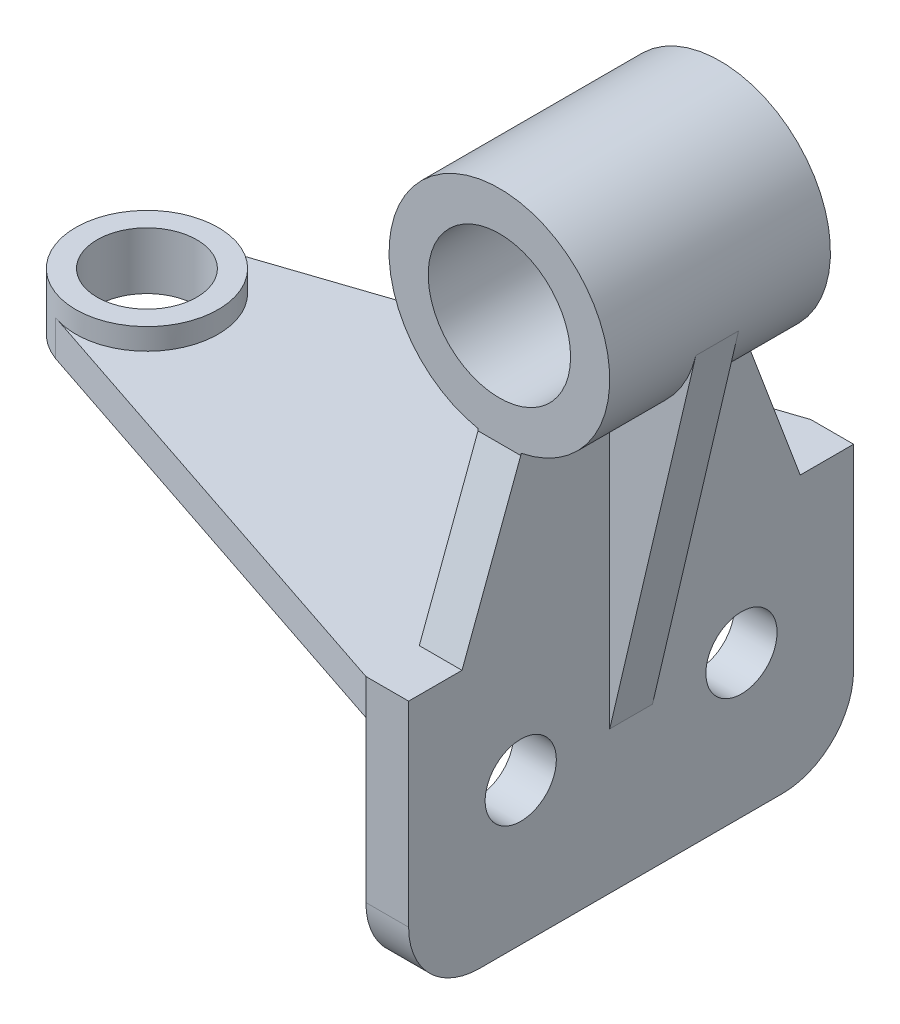
ISO-10303-21;
HEADER;
FILE_DESCRIPTION(('STEP AP214'),'2;1');
FILE_NAME('part.step','',(''),(''),'','','');
FILE_SCHEMA(('AUTOMOTIVE_DESIGN { 1 0 10303 214 1 1 1 1 }'));
ENDSEC;
DATA;
#1=APPLICATION_CONTEXT('core data for automotive mechanical design processes');
#2=APPLICATION_PROTOCOL_DEFINITION('international standard','automotive_design',2000,#1);
#3=PRODUCT_CONTEXT('',#1,'mechanical');
#4=PRODUCT('Part','Part','',(#3));
#5=PRODUCT_RELATED_PRODUCT_CATEGORY('part','',(#4));
#6=PRODUCT_DEFINITION_FORMATION('','',#4);
#7=PRODUCT_DEFINITION_CONTEXT('part definition',#1,'design');
#8=PRODUCT_DEFINITION('design','',#6,#7);
#9=PRODUCT_DEFINITION_SHAPE('','',#8);
#10=(LENGTH_UNIT() NAMED_UNIT(*) SI_UNIT(.MILLI.,.METRE.));
#11=(NAMED_UNIT(*) PLANE_ANGLE_UNIT() SI_UNIT($,.RADIAN.));
#12=(NAMED_UNIT(*) SI_UNIT($,.STERADIAN.) SOLID_ANGLE_UNIT());
#13=UNCERTAINTY_MEASURE_WITH_UNIT(LENGTH_MEASURE(1.E-05),#10,'distance_accuracy_value','');
#14=(GEOMETRIC_REPRESENTATION_CONTEXT(3) GLOBAL_UNCERTAINTY_ASSIGNED_CONTEXT((#13)) GLOBAL_UNIT_ASSIGNED_CONTEXT((#10,
#11,#12)) REPRESENTATION_CONTEXT('',''));
#15=CARTESIAN_POINT('',(0.,0.,0.));
#16=DIRECTION('',(0.,0.,1.));
#17=DIRECTION('',(1.,0.,0.));
#18=AXIS2_PLACEMENT_3D('',#15,#16,#17);
#19=CARTESIAN_POINT('',(-6.,85.,-31.));
#20=DIRECTION('',(0.,0.,1.));
#21=DIRECTION('',(1.,0.,0.));
#22=AXIS2_PLACEMENT_3D('',#19,#20,#21);
#23=CYLINDRICAL_SURFACE('',#22,31.);
#24=CARTESIAN_POINT('',(-6.,85.,31.));
#25=DIRECTION('',(0.,0.,1.));
#26=DIRECTION('',(1.,0.,0.));
#27=AXIS2_PLACEMENT_3D('',#24,#25,#26);
#28=CIRCLE('',#27,31.);
#29=CARTESIAN_POINT('',(0.,54.5861873485089,31.));
#30=VERTEX_POINT('',#29);
#31=CARTESIAN_POINT('',(-12.,54.5861873485089,31.));
#32=VERTEX_POINT('',#31);
#33=EDGE_CURVE('E328',#30,#32,#28,.T.);
#34=ORIENTED_EDGE('',*,*,#33,.F.);
#35=DIRECTION('',(0.,0.,1.));
#36=VECTOR('',#35,1.);
#37=CARTESIAN_POINT('',(0.,54.5861873485089,-31.));
#38=LINE('',#37,#36);
#39=CARTESIAN_POINT('',(0.,54.5861873485089,6.));
#40=VERTEX_POINT('',#39);
#41=EDGE_CURVE('E298',#30,#40,#38,.F.);
#42=ORIENTED_EDGE('',*,*,#41,.T.);
#43=CARTESIAN_POINT('',(-6.,85.,6.));
#44=DIRECTION('',(0.,0.,1.));
#45=DIRECTION('',(1.,0.,0.));
#46=AXIS2_PLACEMENT_3D('',#43,#44,#45);
#47=CIRCLE('',#46,31.);
#48=CARTESIAN_POINT('',(24.1782700582824,77.9097238213609,6.));
#49=VERTEX_POINT('',#48);
#50=EDGE_CURVE('E303',#40,#49,#47,.T.);
#51=ORIENTED_EDGE('',*,*,#50,.T.);
#52=DIRECTION('',(0.,0.,1.));
#53=VECTOR('',#52,1.);
#54=CARTESIAN_POINT('',(24.1782700582824,77.9097238213609,-6.));
#55=LINE('',#54,#53);
#56=CARTESIAN_POINT('',(24.1782700582824,77.9097238213609,-6.));
#57=VERTEX_POINT('',#56);
#58=EDGE_CURVE('E320',#57,#49,#55,.T.);
#59=ORIENTED_EDGE('',*,*,#58,.F.);
#60=CARTESIAN_POINT('',(-6.,85.,-6.));
#61=DIRECTION('',(0.,0.,1.));
#62=DIRECTION('',(1.,0.,0.));
#63=AXIS2_PLACEMENT_3D('',#60,#61,#62);
#64=CIRCLE('',#63,31.);
#65=CARTESIAN_POINT('',(0.,54.5861873485089,-6.));
#66=VERTEX_POINT('',#65);
#67=EDGE_CURVE('E311',#66,#57,#64,.T.);
#68=ORIENTED_EDGE('',*,*,#67,.F.);
#69=CARTESIAN_POINT('',(0.,54.5861873485089,-31.));
#70=VERTEX_POINT('',#69);
#71=EDGE_CURVE('E51',#66,#70,#38,.F.);
#72=ORIENTED_EDGE('',*,*,#71,.T.);
#73=CARTESIAN_POINT('',(-6.,85.,-31.));
#74=DIRECTION('',(0.,0.,1.));
#75=DIRECTION('',(1.,0.,0.));
#76=AXIS2_PLACEMENT_3D('',#73,#74,#75);
#77=CIRCLE('',#76,31.);
#78=CARTESIAN_POINT('',(-12.,54.5861873485089,-31.));
#79=VERTEX_POINT('',#78);
#80=EDGE_CURVE('E11',#70,#79,#77,.T.);
#81=ORIENTED_EDGE('',*,*,#80,.T.);
#82=DIRECTION('',(0.,0.,1.));
#83=VECTOR('',#82,1.);
#84=CARTESIAN_POINT('',(-12.,54.5861873485089,-31.));
#85=LINE('',#84,#83);
#86=EDGE_CURVE('E301',#32,#79,#85,.F.);
#87=ORIENTED_EDGE('',*,*,#86,.F.);
#88=EDGE_LOOP('',(#34,#42,#51,#59,#68,#72,#81,#87));
#89=FACE_BOUND('',#88,.T.);
#90=ADVANCED_FACE('F38',(#89),#23,.T.);
#91=CARTESIAN_POINT('',(-6.,85.,-31.));
#92=DIRECTION('',(0.,0.,1.));
#93=DIRECTION('',(1.,0.,0.));
#94=AXIS2_PLACEMENT_3D('',#91,#92,#93);
#95=PLANE('',#94);
#96=ORIENTED_EDGE('',*,*,#80,.F.);
#97=DIRECTION('',(0.,1.,0.));
#98=VECTOR('',#97,1.);
#99=CARTESIAN_POINT('',(0.,60.6182937655706,-31.));
#100=LINE('',#99,#98);
#101=CARTESIAN_POINT('',(0.,54.,-31.));
#102=VERTEX_POINT('',#101);
#103=EDGE_CURVE('E232',#102,#70,#100,.T.);
#104=ORIENTED_EDGE('',*,*,#103,.F.);
#105=DIRECTION('',(1.,0.,0.));
#106=VECTOR('',#105,1.);
#107=CARTESIAN_POINT('',(-12.,54.,-31.));
#108=LINE('',#107,#106);
#109=CARTESIAN_POINT('',(-12.,54.,-31.));
#110=VERTEX_POINT('',#109);
#111=EDGE_CURVE('E246',#110,#102,#108,.T.);
#112=ORIENTED_EDGE('',*,*,#111,.F.);
#113=DIRECTION('',(0.,1.,0.));
#114=VECTOR('',#113,1.);
#115=CARTESIAN_POINT('',(-12.,60.6182937655706,-31.));
#116=LINE('',#115,#114);
#117=EDGE_CURVE('E220',#110,#79,#116,.T.);
#118=ORIENTED_EDGE('',*,*,#117,.T.);
#119=EDGE_LOOP('',(#96,#104,#112,#118));
#120=FACE_BOUND('',#119,.T.);
#121=CARTESIAN_POINT('',(-6.,85.,-31.));
#122=DIRECTION('',(0.,0.,1.));
#123=DIRECTION('',(1.,0.,0.));
#124=AXIS2_PLACEMENT_3D('',#121,#122,#123);
#125=CIRCLE('',#124,20.);
#126=CARTESIAN_POINT('',(14.,85.,-31.));
#127=VERTEX_POINT('',#126);
#128=EDGE_CURVE('E45',#127,#127,#125,.T.);
#129=ORIENTED_EDGE('',*,*,#128,.T.);
#130=EDGE_LOOP('',(#129));
#131=FACE_BOUND('',#130,.T.);
#132=ADVANCED_FACE('F333',(#120,#131),#95,.F.);
#133=CARTESIAN_POINT('',(-6.,85.,-31.));
#134=DIRECTION('',(0.,0.,1.));
#135=DIRECTION('',(1.,0.,0.));
#136=AXIS2_PLACEMENT_3D('',#133,#134,#135);
#137=CYLINDRICAL_SURFACE('',#136,20.);
#138=ORIENTED_EDGE('',*,*,#128,.F.);
#139=EDGE_LOOP('',(#138));
#140=FACE_BOUND('',#139,.T.);
#141=CARTESIAN_POINT('',(-6.,85.,31.));
#142=DIRECTION('',(0.,0.,1.));
#143=DIRECTION('',(1.,0.,0.));
#144=AXIS2_PLACEMENT_3D('',#141,#142,#143);
#145=CIRCLE('',#144,20.);
#146=CARTESIAN_POINT('',(14.,85.,31.));
#147=VERTEX_POINT('',#146);
#148=EDGE_CURVE('E323',#147,#147,#145,.T.);
#149=ORIENTED_EDGE('',*,*,#148,.T.);
#150=EDGE_LOOP('',(#149));
#151=FACE_BOUND('',#150,.T.);
#152=ADVANCED_FACE('F335',(#140,#151),#137,.F.);
#153=CARTESIAN_POINT('',(-6.,85.,31.));
#154=DIRECTION('',(0.,0.,1.));
#155=DIRECTION('',(1.,0.,0.));
#156=AXIS2_PLACEMENT_3D('',#153,#154,#155);
#157=PLANE('',#156);
#158=DIRECTION('',(0.,-1.,0.));
#159=VECTOR('',#158,1.);
#160=CARTESIAN_POINT('',(-12.,54.,31.));
#161=LINE('',#160,#159);
#162=CARTESIAN_POINT('',(-12.,54.,31.));
#163=VERTEX_POINT('',#162);
#164=EDGE_CURVE('E223',#32,#163,#161,.T.);
#165=ORIENTED_EDGE('',*,*,#164,.T.);
#166=DIRECTION('',(1.,0.,0.));
#167=VECTOR('',#166,1.);
#168=CARTESIAN_POINT('',(-12.,54.,31.));
#169=LINE('',#168,#167);
#170=CARTESIAN_POINT('',(0.,54.,31.));
#171=VERTEX_POINT('',#170);
#172=EDGE_CURVE('E244',#163,#171,#169,.T.);
#173=ORIENTED_EDGE('',*,*,#172,.T.);
#174=DIRECTION('',(0.,-1.,0.));
#175=VECTOR('',#174,1.);
#176=CARTESIAN_POINT('',(0.,54.,31.));
#177=LINE('',#176,#175);
#178=EDGE_CURVE('E235',#30,#171,#177,.T.);
#179=ORIENTED_EDGE('',*,*,#178,.F.);
#180=ORIENTED_EDGE('',*,*,#33,.T.);
#181=EDGE_LOOP('',(#165,#173,#179,#180));
#182=FACE_BOUND('',#181,.T.);
#183=ORIENTED_EDGE('',*,*,#148,.F.);
#184=EDGE_LOOP('',(#183));
#185=FACE_BOUND('',#184,.T.);
#186=ADVANCED_FACE('F338',(#182,#185),#157,.T.);
#187=CARTESIAN_POINT('',(5.56639618383919,-1.30780479420858,-6.));
#188=DIRECTION('',(-0.973492582525238,0.228718586407714,0.));
#189=DIRECTION('',(-0.228718586407714,-0.973492582525238,0.));
#190=AXIS2_PLACEMENT_3D('',#187,#188,#189);
#191=PLANE('',#190);
#192=ORIENTED_EDGE('',*,*,#58,.T.);
#193=DIRECTION('',(-0.228718586407714,-0.973492582525238,0.));
#194=VECTOR('',#193,1.);
#195=CARTESIAN_POINT('',(5.56639618383919,-1.30780479420858,6.));
#196=LINE('',#195,#194);
#197=CARTESIAN_POINT('',(0.,-25.,6.));
#198=VERTEX_POINT('',#197);
#199=EDGE_CURVE('E308',#49,#198,#196,.T.);
#200=ORIENTED_EDGE('',*,*,#199,.T.);
#201=DIRECTION('',(0.,0.,1.));
#202=VECTOR('',#201,1.);
#203=CARTESIAN_POINT('',(0.,-25.,-6.));
#204=LINE('',#203,#202);
#205=CARTESIAN_POINT('',(0.,-25.,-6.));
#206=VERTEX_POINT('',#205);
#207=EDGE_CURVE('E319',#206,#198,#204,.T.);
#208=ORIENTED_EDGE('',*,*,#207,.F.);
#209=DIRECTION('',(-0.228718586407714,-0.973492582525238,0.));
#210=VECTOR('',#209,1.);
#211=CARTESIAN_POINT('',(5.56639618383919,-1.30780479420858,-6.));
#212=LINE('',#211,#210);
#213=EDGE_CURVE('E317',#57,#206,#212,.T.);
#214=ORIENTED_EDGE('',*,*,#213,.F.);
#215=EDGE_LOOP('',(#192,#200,#208,#214));
#216=FACE_BOUND('',#215,.T.);
#217=ADVANCED_FACE('F343',(#216),#191,.F.);
#218=CARTESIAN_POINT('',(0.,0.,-6.));
#219=DIRECTION('',(0.,0.,1.));
#220=DIRECTION('',(1.,0.,0.));
#221=AXIS2_PLACEMENT_3D('',#218,#219,#220);
#222=PLANE('',#221);
#223=ORIENTED_EDGE('',*,*,#67,.T.);
#224=ORIENTED_EDGE('',*,*,#213,.T.);
#225=DIRECTION('',(0.,1.,0.));
#226=VECTOR('',#225,1.);
#227=CARTESIAN_POINT('',(0.,0.,-6.));
#228=LINE('',#227,#226);
#229=EDGE_CURVE('E314',#206,#66,#228,.T.);
#230=ORIENTED_EDGE('',*,*,#229,.T.);
#231=EDGE_LOOP('',(#223,#224,#230));
#232=FACE_BOUND('',#231,.T.);
#233=ADVANCED_FACE('F351',(#232),#222,.F.);
#234=CARTESIAN_POINT('',(0.,0.,6.));
#235=DIRECTION('',(0.,0.,1.));
#236=DIRECTION('',(1.,0.,0.));
#237=AXIS2_PLACEMENT_3D('',#234,#235,#236);
#238=PLANE('',#237);
#239=ORIENTED_EDGE('',*,*,#50,.F.);
#240=DIRECTION('',(0.,1.,0.));
#241=VECTOR('',#240,1.);
#242=CARTESIAN_POINT('',(0.,0.,6.));
#243=LINE('',#242,#241);
#244=EDGE_CURVE('E305',#198,#40,#243,.T.);
#245=ORIENTED_EDGE('',*,*,#244,.F.);
#246=ORIENTED_EDGE('',*,*,#199,.F.);
#247=EDGE_LOOP('',(#239,#245,#246));
#248=FACE_BOUND('',#247,.T.);
#249=ADVANCED_FACE('F413',(#248),#238,.T.);
#250=CARTESIAN_POINT('',(0.,10.,0.));
#251=DIRECTION('',(-1.,0.,0.));
#252=DIRECTION('',(0.,0.,1.));
#253=AXIS2_PLACEMENT_3D('',#250,#251,#252);
#254=PLANE('',#253);
#255=ORIENTED_EDGE('',*,*,#41,.F.);
#256=ORIENTED_EDGE('',*,*,#178,.T.);
#257=DIRECTION('',(0.,-0.936329177569045,0.351123441588392));
#258=VECTOR('',#257,1.);
#259=CARTESIAN_POINT('',(0.,10.,47.5));
#260=LINE('',#259,#258);
#261=CARTESIAN_POINT('',(0.,10.,47.5));
#262=VERTEX_POINT('',#261);
#263=EDGE_CURVE('E217',#171,#262,#260,.T.);
#264=ORIENTED_EDGE('',*,*,#263,.T.);
#265=DIRECTION('',(0.,0.,-1.));
#266=VECTOR('',#265,1.);
#267=CARTESIAN_POINT('',(0.,10.,0.));
#268=LINE('',#267,#266);
#269=CARTESIAN_POINT('',(0.,10.,62.5));
#270=VERTEX_POINT('',#269);
#271=EDGE_CURVE('E263',#270,#262,#268,.T.);
#272=ORIENTED_EDGE('',*,*,#271,.F.);
#273=DIRECTION('',(0.,-1.,0.));
#274=VECTOR('',#273,1.);
#275=CARTESIAN_POINT('',(0.,10.,62.5));
#276=LINE('',#275,#274);
#277=CARTESIAN_POINT('',(0.,-45.,62.5));
#278=VERTEX_POINT('',#277);
#279=EDGE_CURVE('E278',#270,#278,#276,.T.);
#280=ORIENTED_EDGE('',*,*,#279,.T.);
#281=CARTESIAN_POINT('',(0.,-45.,42.5));
#282=DIRECTION('',(1.,0.,0.));
#283=DIRECTION('',(0.,0.,-1.));
#284=AXIS2_PLACEMENT_3D('',#281,#282,#283);
#285=CIRCLE('',#284,20.);
#286=CARTESIAN_POINT('',(0.,-65.,42.5));
#287=VERTEX_POINT('',#286);
#288=EDGE_CURVE('E167',#278,#287,#285,.T.);
#289=ORIENTED_EDGE('',*,*,#288,.T.);
#290=DIRECTION('',(0.,0.,-1.));
#291=VECTOR('',#290,1.);
#292=CARTESIAN_POINT('',(0.,-65.,42.5));
#293=LINE('',#292,#291);
#294=CARTESIAN_POINT('',(0.,-65.,-42.5));
#295=VERTEX_POINT('',#294);
#296=EDGE_CURVE('E201',#287,#295,#293,.T.);
#297=ORIENTED_EDGE('',*,*,#296,.T.);
#298=CARTESIAN_POINT('',(0.,-45.,-42.5));
#299=DIRECTION('',(1.,0.,0.));
#300=DIRECTION('',(0.,0.,1.));
#301=AXIS2_PLACEMENT_3D('',#298,#299,#300);
#302=CIRCLE('',#301,20.);
#303=CARTESIAN_POINT('',(0.,-45.,-62.5));
#304=VERTEX_POINT('',#303);
#305=EDGE_CURVE('E190',#295,#304,#302,.T.);
#306=ORIENTED_EDGE('',*,*,#305,.T.);
#307=DIRECTION('',(0.,-1.,0.));
#308=VECTOR('',#307,1.);
#309=CARTESIAN_POINT('',(0.,10.,-62.5));
#310=LINE('',#309,#308);
#311=CARTESIAN_POINT('',(0.,10.,-62.5));
#312=VERTEX_POINT('',#311);
#313=EDGE_CURVE('E296',#312,#304,#310,.T.);
#314=ORIENTED_EDGE('',*,*,#313,.F.);
#315=CARTESIAN_POINT('',(0.,10.,-47.5));
#316=VERTEX_POINT('',#315);
#317=EDGE_CURVE('E266',#316,#312,#268,.T.);
#318=ORIENTED_EDGE('',*,*,#317,.F.);
#319=DIRECTION('',(0.,0.936329177569044,0.351123441588392));
#320=VECTOR('',#319,1.);
#321=CARTESIAN_POINT('',(0.,54.,-31.));
#322=LINE('',#321,#320);
#323=EDGE_CURVE('E210',#316,#102,#322,.T.);
#324=ORIENTED_EDGE('',*,*,#323,.T.);
#325=ORIENTED_EDGE('',*,*,#103,.T.);
#326=ORIENTED_EDGE('',*,*,#71,.F.);
#327=ORIENTED_EDGE('',*,*,#229,.F.);
#328=ORIENTED_EDGE('',*,*,#207,.T.);
#329=ORIENTED_EDGE('',*,*,#244,.T.);
#330=EDGE_LOOP('',(#255,#256,#264,#272,#280,#289,#297,#306,#314,#318,#324,#325,#326,#327,#328,#329));
#331=FACE_BOUND('',#330,.T.);
#332=CARTESIAN_POINT('',(0.,-25.,-31.));
#333=DIRECTION('',(1.,0.,0.));
#334=DIRECTION('',(0.,0.,-1.));
#335=AXIS2_PLACEMENT_3D('',#332,#333,#334);
#336=CIRCLE('',#335,10.);
#337=CARTESIAN_POINT('',(0.,-25.,-41.));
#338=VERTEX_POINT('',#337);
#339=EDGE_CURVE('E718',#338,#338,#336,.T.);
#340=ORIENTED_EDGE('',*,*,#339,.F.);
#341=EDGE_LOOP('',(#340));
#342=FACE_BOUND('',#341,.T.);
#343=CARTESIAN_POINT('',(0.,-25.,31.));
#344=DIRECTION('',(1.,0.,0.));
#345=DIRECTION('',(0.,0.,-1.));
#346=AXIS2_PLACEMENT_3D('',#343,#344,#345);
#347=CIRCLE('',#346,10.);
#348=CARTESIAN_POINT('',(0.,-25.,21.));
#349=VERTEX_POINT('',#348);
#350=EDGE_CURVE('E720',#349,#349,#347,.T.);
#351=ORIENTED_EDGE('',*,*,#350,.F.);
#352=EDGE_LOOP('',(#351));
#353=FACE_BOUND('',#352,.T.);
#354=ADVANCED_FACE('F363',(#331,#342,#353),#254,.F.);
#355=CARTESIAN_POINT('',(0.,10.,-62.5));
#356=DIRECTION('',(0.,0.,1.));
#357=DIRECTION('',(1.,0.,0.));
#358=AXIS2_PLACEMENT_3D('',#355,#356,#357);
#359=PLANE('',#358);
#360=ORIENTED_EDGE('',*,*,#313,.T.);
#361=DIRECTION('',(1.,0.,0.));
#362=VECTOR('',#361,1.);
#363=CARTESIAN_POINT('',(-12.,-45.,-62.5));
#364=LINE('',#363,#362);
#365=CARTESIAN_POINT('',(-12.,-45.,-62.5));
#366=VERTEX_POINT('',#365);
#367=EDGE_CURVE('E207',#366,#304,#364,.T.);
#368=ORIENTED_EDGE('',*,*,#367,.F.);
#369=DIRECTION('',(0.,1.,0.));
#370=VECTOR('',#369,1.);
#371=CARTESIAN_POINT('',(-12.,-45.,-62.5));
#372=LINE('',#371,#370);
#373=CARTESIAN_POINT('',(-12.,0.,-62.5));
#374=VERTEX_POINT('',#373);
#375=EDGE_CURVE('E172',#366,#374,#372,.T.);
#376=ORIENTED_EDGE('',*,*,#375,.T.);
#377=DIRECTION('',(0.,-1.,0.));
#378=VECTOR('',#377,1.);
#379=CARTESIAN_POINT('',(-12.,10.,-62.5));
#380=LINE('',#379,#378);
#381=CARTESIAN_POINT('',(-12.,10.,-62.5));
#382=VERTEX_POINT('',#381);
#383=EDGE_CURVE('E293',#382,#374,#380,.T.);
#384=ORIENTED_EDGE('',*,*,#383,.F.);
#385=DIRECTION('',(-1.,0.,0.));
#386=VECTOR('',#385,1.);
#387=CARTESIAN_POINT('',(0.,10.,-62.5));
#388=LINE('',#387,#386);
#389=EDGE_CURVE('E265',#312,#382,#388,.T.);
#390=ORIENTED_EDGE('',*,*,#389,.F.);
#391=EDGE_LOOP('',(#360,#368,#376,#384,#390));
#392=FACE_BOUND('',#391,.T.);
#393=ADVANCED_FACE('F384',(#392),#359,.F.);
#394=CARTESIAN_POINT('',(-12.,10.,-62.5));
#395=DIRECTION('',(0.316783244819281,0.,0.948497957721453));
#396=DIRECTION('',(0.948497957721453,0.,-0.316783244819281));
#397=AXIS2_PLACEMENT_3D('',#394,#395,#396);
#398=PLANE('',#397);
#399=DIRECTION('',(-0.948497957721453,0.,0.316783244819281));
#400=VECTOR('',#399,1.);
#401=CARTESIAN_POINT('',(-12.,0.,-62.5));
#402=LINE('',#401,#400);
#403=CARTESIAN_POINT('',(-142.335664896386,0.,-18.9699591544291));
#404=VERTEX_POINT('',#403);
#405=EDGE_CURVE('E259',#374,#404,#402,.T.);
#406=ORIENTED_EDGE('',*,*,#405,.T.);
#407=DIRECTION('',(0.,-1.,0.));
#408=VECTOR('',#407,1.);
#409=CARTESIAN_POINT('',(-142.335664896386,10.,-18.9699591544291));
#410=LINE('',#409,#408);
#411=CARTESIAN_POINT('',(-142.335664896386,10.,-18.9699591544291));
#412=VERTEX_POINT('',#411);
#413=EDGE_CURVE('E290',#412,#404,#410,.T.);
#414=ORIENTED_EDGE('',*,*,#413,.F.);
#415=DIRECTION('',(-0.948497957721453,0.,0.316783244819281));
#416=VECTOR('',#415,1.);
#417=CARTESIAN_POINT('',(-12.,10.,-62.5));
#418=LINE('',#417,#416);
#419=EDGE_CURVE('E268',#382,#412,#418,.T.);
#420=ORIENTED_EDGE('',*,*,#419,.F.);
#421=ORIENTED_EDGE('',*,*,#383,.T.);
#422=EDGE_LOOP('',(#406,#414,#420,#421));
#423=FACE_BOUND('',#422,.T.);
#424=ADVANCED_FACE('F388',(#423),#398,.F.);
#425=CARTESIAN_POINT('',(-136.,10.,0.));
#426=DIRECTION('',(0.,-1.,0.));
#427=DIRECTION('',(0.,0.,-1.));
#428=AXIS2_PLACEMENT_3D('',#425,#426,#427);
#429=CYLINDRICAL_SURFACE('',#428,20.);
#430=CARTESIAN_POINT('',(-136.,0.,0.));
#431=DIRECTION('',(0.,1.,0.));
#432=DIRECTION('',(0.,0.,1.));
#433=AXIS2_PLACEMENT_3D('',#430,#431,#432);
#434=CIRCLE('',#433,20.);
#435=CARTESIAN_POINT('',(-142.957379404208,0.,18.7508632288196));
#436=VERTEX_POINT('',#435);
#437=EDGE_CURVE('E280',#404,#436,#434,.T.);
#438=ORIENTED_EDGE('',*,*,#437,.T.);
#439=DIRECTION('',(0.,-1.,0.));
#440=VECTOR('',#439,1.);
#441=CARTESIAN_POINT('',(-142.957379404208,10.,18.7508632288196));
#442=LINE('',#441,#440);
#443=CARTESIAN_POINT('',(-142.957379404208,10.,18.7508632288196));
#444=VERTEX_POINT('',#443);
#445=EDGE_CURVE('E287',#444,#436,#442,.T.);
#446=ORIENTED_EDGE('',*,*,#445,.F.);
#447=CARTESIAN_POINT('',(-136.,10.,0.));
#448=DIRECTION('',(0.,1.,0.));
#449=DIRECTION('',(0.,0.,1.));
#450=AXIS2_PLACEMENT_3D('',#447,#448,#449);
#451=CIRCLE('',#450,20.);
#452=CARTESIAN_POINT('',(-141.710083989792,10.,19.1675491607436));
#453=VERTEX_POINT('',#452);
#454=EDGE_CURVE('E255',#444,#453,#451,.T.);
#455=ORIENTED_EDGE('',*,*,#454,.T.);
#456=EDGE_CURVE('E262',#453,#412,#451,.T.);
#457=ORIENTED_EDGE('',*,*,#456,.T.);
#458=ORIENTED_EDGE('',*,*,#413,.T.);
#459=EDGE_LOOP('',(#438,#446,#455,#457,#458));
#460=FACE_BOUND('',#459,.T.);
#461=CARTESIAN_POINT('',(-136.,16.,0.));
#462=DIRECTION('',(0.,1.,0.));
#463=DIRECTION('',(0.,0.,1.));
#464=AXIS2_PLACEMENT_3D('',#461,#462,#463);
#465=CIRCLE('',#464,20.);
#466=CARTESIAN_POINT('',(-136.,16.,20.));
#467=VERTEX_POINT('',#466);
#468=EDGE_CURVE('E256',#467,#467,#465,.T.);
#469=ORIENTED_EDGE('',*,*,#468,.F.);
#470=EDGE_LOOP('',(#469));
#471=FACE_BOUND('',#470,.T.);
#472=ADVANCED_FACE('F390',(#460,#471),#429,.T.);
#473=CARTESIAN_POINT('',(-12.,10.,62.5));
#474=DIRECTION('',(0.316857870349824,0.,-0.948473030716938));
#475=DIRECTION('',(-0.948473030716938,0.,-0.316857870349824));
#476=AXIS2_PLACEMENT_3D('',#473,#474,#475);
#477=PLANE('',#476);
#478=DIRECTION('',(0.948473030716938,0.,0.316857870349824));
#479=VECTOR('',#478,1.);
#480=CARTESIAN_POINT('',(-12.,0.,62.5));
#481=LINE('',#480,#479);
#482=CARTESIAN_POINT('',(-12.,0.,62.5));
#483=VERTEX_POINT('',#482);
#484=EDGE_CURVE('E282',#436,#483,#481,.T.);
#485=ORIENTED_EDGE('',*,*,#484,.T.);
#486=DIRECTION('',(0.,-1.,0.));
#487=VECTOR('',#486,1.);
#488=CARTESIAN_POINT('',(-12.,10.,62.5));
#489=LINE('',#488,#487);
#490=CARTESIAN_POINT('',(-12.,10.,62.5));
#491=VERTEX_POINT('',#490);
#492=EDGE_CURVE('E187',#491,#483,#489,.T.);
#493=ORIENTED_EDGE('',*,*,#492,.F.);
#494=DIRECTION('',(0.948473030716938,0.,0.316857870349824));
#495=VECTOR('',#494,1.);
#496=CARTESIAN_POINT('',(-12.,10.,62.5));
#497=LINE('',#496,#495);
#498=EDGE_CURVE('E271',#453,#491,#497,.T.);
#499=ORIENTED_EDGE('',*,*,#498,.F.);
#500=EDGE_CURVE('E272',#444,#453,#497,.T.);
#501=ORIENTED_EDGE('',*,*,#500,.F.);
#502=ORIENTED_EDGE('',*,*,#445,.T.);
#503=EDGE_LOOP('',(#485,#493,#499,#501,#502));
#504=FACE_BOUND('',#503,.T.);
#505=ADVANCED_FACE('F375',(#504),#477,.F.);
#506=CARTESIAN_POINT('',(0.,10.,62.5));
#507=DIRECTION('',(0.,0.,-1.));
#508=DIRECTION('',(-1.,0.,0.));
#509=AXIS2_PLACEMENT_3D('',#506,#507,#508);
#510=PLANE('',#509);
#511=ORIENTED_EDGE('',*,*,#492,.T.);
#512=DIRECTION('',(0.,-1.,0.));
#513=VECTOR('',#512,1.);
#514=CARTESIAN_POINT('',(-12.,0.,62.5));
#515=LINE('',#514,#513);
#516=CARTESIAN_POINT('',(-12.,-45.,62.5));
#517=VERTEX_POINT('',#516);
#518=EDGE_CURVE('E177',#483,#517,#515,.T.);
#519=ORIENTED_EDGE('',*,*,#518,.T.);
#520=DIRECTION('',(1.,0.,0.));
#521=VECTOR('',#520,1.);
#522=CARTESIAN_POINT('',(-12.,-45.,62.5));
#523=LINE('',#522,#521);
#524=EDGE_CURVE('E162',#517,#278,#523,.T.);
#525=ORIENTED_EDGE('',*,*,#524,.T.);
#526=ORIENTED_EDGE('',*,*,#279,.F.);
#527=DIRECTION('',(1.,0.,0.));
#528=VECTOR('',#527,1.);
#529=CARTESIAN_POINT('',(0.,10.,62.5));
#530=LINE('',#529,#528);
#531=EDGE_CURVE('E275',#491,#270,#530,.T.);
#532=ORIENTED_EDGE('',*,*,#531,.F.);
#533=EDGE_LOOP('',(#511,#519,#525,#526,#532));
#534=FACE_BOUND('',#533,.T.);
#535=ADVANCED_FACE('F184',(#534),#510,.F.);
#536=CARTESIAN_POINT('',(-136.,10.,0.));
#537=DIRECTION('',(0.,1.,0.));
#538=DIRECTION('',(0.,0.,1.));
#539=AXIS2_PLACEMENT_3D('',#536,#537,#538);
#540=PLANE('',#539);
#541=DIRECTION('',(1.,0.,0.));
#542=VECTOR('',#541,1.);
#543=CARTESIAN_POINT('',(-12.,10.,47.5));
#544=LINE('',#543,#542);
#545=CARTESIAN_POINT('',(-12.,10.,47.5));
#546=VERTEX_POINT('',#545);
#547=EDGE_CURVE('E240',#546,#262,#544,.T.);
#548=ORIENTED_EDGE('',*,*,#547,.F.);
#549=DIRECTION('',(0.,0.,-1.));
#550=VECTOR('',#549,1.);
#551=CARTESIAN_POINT('',(-12.,10.,47.5));
#552=LINE('',#551,#550);
#553=CARTESIAN_POINT('',(-12.,10.,-47.5));
#554=VERTEX_POINT('',#553);
#555=EDGE_CURVE('E214',#546,#554,#552,.T.);
#556=ORIENTED_EDGE('',*,*,#555,.T.);
#557=DIRECTION('',(1.,0.,0.));
#558=VECTOR('',#557,1.);
#559=CARTESIAN_POINT('',(-12.,10.,-47.5));
#560=LINE('',#559,#558);
#561=EDGE_CURVE('E229',#554,#316,#560,.T.);
#562=ORIENTED_EDGE('',*,*,#561,.T.);
#563=ORIENTED_EDGE('',*,*,#317,.T.);
#564=ORIENTED_EDGE('',*,*,#389,.T.);
#565=ORIENTED_EDGE('',*,*,#419,.T.);
#566=ORIENTED_EDGE('',*,*,#456,.F.);
#567=ORIENTED_EDGE('',*,*,#498,.T.);
#568=ORIENTED_EDGE('',*,*,#531,.T.);
#569=ORIENTED_EDGE('',*,*,#271,.T.);
#570=EDGE_LOOP('',(#548,#556,#562,#563,#564,#565,#566,#567,#568,#569));
#571=FACE_BOUND('',#570,.T.);
#572=ADVANCED_FACE('F370',(#571),#540,.T.);
#573=CARTESIAN_POINT('',(-136.,0.,0.));
#574=DIRECTION('',(0.,1.,0.));
#575=DIRECTION('',(0.,0.,1.));
#576=AXIS2_PLACEMENT_3D('',#573,#574,#575);
#577=PLANE('',#576);
#578=CARTESIAN_POINT('',(-136.,0.,0.));
#579=DIRECTION('',(0.,1.,0.));
#580=DIRECTION('',(0.,0.,1.));
#581=AXIS2_PLACEMENT_3D('',#578,#579,#580);
#582=CIRCLE('',#581,14.);
#583=CARTESIAN_POINT('',(-136.,0.,14.));
#584=VERTEX_POINT('',#583);
#585=EDGE_CURVE('E252',#584,#584,#582,.F.);
#586=ORIENTED_EDGE('',*,*,#585,.F.);
#587=EDGE_LOOP('',(#586));
#588=FACE_BOUND('',#587,.T.);
#589=ORIENTED_EDGE('',*,*,#405,.F.);
#590=DIRECTION('',(0.,0.,1.));
#591=VECTOR('',#590,1.);
#592=CARTESIAN_POINT('',(-12.,0.,62.5));
#593=LINE('',#592,#591);
#594=EDGE_CURVE('E188',#374,#483,#593,.T.);
#595=ORIENTED_EDGE('',*,*,#594,.T.);
#596=ORIENTED_EDGE('',*,*,#484,.F.);
#597=ORIENTED_EDGE('',*,*,#437,.F.);
#598=EDGE_LOOP('',(#589,#595,#596,#597));
#599=FACE_BOUND('',#598,.T.);
#600=ADVANCED_FACE('F380',(#588,#599),#577,.F.);
#601=CARTESIAN_POINT('',(-136.,10.,0.));
#602=DIRECTION('',(0.,1.,0.));
#603=DIRECTION('',(0.,0.,1.));
#604=AXIS2_PLACEMENT_3D('',#601,#602,#603);
#605=PLANE('',#604);
#606=ORIENTED_EDGE('',*,*,#454,.F.);
#607=ORIENTED_EDGE('',*,*,#500,.T.);
#608=EDGE_LOOP('',(#606,#607));
#609=FACE_BOUND('',#608,.T.);
#610=ADVANCED_FACE('F394',(#609),#605,.F.);
#611=CARTESIAN_POINT('',(-136.,16.,0.));
#612=DIRECTION('',(0.,1.,0.));
#613=DIRECTION('',(0.,0.,1.));
#614=AXIS2_PLACEMENT_3D('',#611,#612,#613);
#615=PLANE('',#614);
#616=CARTESIAN_POINT('',(-136.,16.,0.));
#617=DIRECTION('',(0.,1.,0.));
#618=DIRECTION('',(0.,0.,1.));
#619=AXIS2_PLACEMENT_3D('',#616,#617,#618);
#620=CIRCLE('',#619,14.);
#621=CARTESIAN_POINT('',(-136.,16.,14.));
#622=VERTEX_POINT('',#621);
#623=EDGE_CURVE('E243',#622,#622,#620,.T.);
#624=ORIENTED_EDGE('',*,*,#623,.F.);
#625=EDGE_LOOP('',(#624));
#626=FACE_BOUND('',#625,.T.);
#627=ORIENTED_EDGE('',*,*,#468,.T.);
#628=EDGE_LOOP('',(#627));
#629=FACE_BOUND('',#628,.T.);
#630=ADVANCED_FACE('F396',(#626,#629),#615,.T.);
#631=CARTESIAN_POINT('',(-136.,-0.001000000000001,0.));
#632=DIRECTION('',(0.,1.,0.));
#633=DIRECTION('',(0.,0.,1.));
#634=AXIS2_PLACEMENT_3D('',#631,#632,#633);
#635=CYLINDRICAL_SURFACE('',#634,14.);
#636=ORIENTED_EDGE('',*,*,#623,.T.);
#637=EDGE_LOOP('',(#636));
#638=FACE_BOUND('',#637,.T.);
#639=ORIENTED_EDGE('',*,*,#585,.T.);
#640=EDGE_LOOP('',(#639));
#641=FACE_BOUND('',#640,.T.);
#642=ADVANCED_FACE('F402',(#638,#641),#635,.F.);
#643=CARTESIAN_POINT('',(-12.,10.,47.5));
#644=DIRECTION('',(0.,0.351123441588392,0.936329177569044));
#645=DIRECTION('',(0.,-0.936329177569045,0.351123441588392));
#646=AXIS2_PLACEMENT_3D('',#643,#644,#645);
#647=PLANE('',#646);
#648=ORIENTED_EDGE('',*,*,#263,.F.);
#649=ORIENTED_EDGE('',*,*,#172,.F.);
#650=DIRECTION('',(0.,-0.936329177569045,0.351123441588392));
#651=VECTOR('',#650,1.);
#652=CARTESIAN_POINT('',(-12.,10.,47.5));
#653=LINE('',#652,#651);
#654=EDGE_CURVE('E226',#163,#546,#653,.T.);
#655=ORIENTED_EDGE('',*,*,#654,.T.);
#656=ORIENTED_EDGE('',*,*,#547,.T.);
#657=EDGE_LOOP('',(#648,#649,#655,#656));
#658=FACE_BOUND('',#657,.T.);
#659=ADVANCED_FACE('F368',(#658),#647,.T.);
#660=CARTESIAN_POINT('',(-12.,54.,-31.));
#661=DIRECTION('',(0.,0.351123441588392,-0.936329177569044));
#662=DIRECTION('',(0.,0.936329177569045,0.351123441588392));
#663=AXIS2_PLACEMENT_3D('',#660,#661,#662);
#664=PLANE('',#663);
#665=ORIENTED_EDGE('',*,*,#323,.F.);
#666=ORIENTED_EDGE('',*,*,#561,.F.);
#667=DIRECTION('',(0.,0.936329177569044,0.351123441588392));
#668=VECTOR('',#667,1.);
#669=CARTESIAN_POINT('',(-12.,54.,-31.));
#670=LINE('',#669,#668);
#671=EDGE_CURVE('E216',#554,#110,#670,.T.);
#672=ORIENTED_EDGE('',*,*,#671,.T.);
#673=ORIENTED_EDGE('',*,*,#111,.T.);
#674=EDGE_LOOP('',(#665,#666,#672,#673));
#675=FACE_BOUND('',#674,.T.);
#676=ADVANCED_FACE('F444',(#675),#664,.T.);
#677=CARTESIAN_POINT('',(-12.,0.,0.));
#678=DIRECTION('',(-1.,0.,0.));
#679=DIRECTION('',(0.,0.,1.));
#680=AXIS2_PLACEMENT_3D('',#677,#678,#679);
#681=PLANE('',#680);
#682=ORIENTED_EDGE('',*,*,#164,.F.);
#683=ORIENTED_EDGE('',*,*,#86,.T.);
#684=ORIENTED_EDGE('',*,*,#117,.F.);
#685=ORIENTED_EDGE('',*,*,#671,.F.);
#686=ORIENTED_EDGE('',*,*,#555,.F.);
#687=ORIENTED_EDGE('',*,*,#654,.F.);
#688=EDGE_LOOP('',(#682,#683,#684,#685,#686,#687));
#689=FACE_BOUND('',#688,.T.);
#690=ADVANCED_FACE('F440',(#689),#681,.T.);
#691=CARTESIAN_POINT('',(-12.,-45.,-42.5));
#692=DIRECTION('',(1.,0.,0.));
#693=DIRECTION('',(0.,0.,-1.));
#694=AXIS2_PLACEMENT_3D('',#691,#692,#693);
#695=CYLINDRICAL_SURFACE('',#694,20.);
#696=ORIENTED_EDGE('',*,*,#305,.F.);
#697=DIRECTION('',(1.,0.,0.));
#698=VECTOR('',#697,1.);
#699=CARTESIAN_POINT('',(-12.,-65.,-42.5));
#700=LINE('',#699,#698);
#701=CARTESIAN_POINT('',(-12.,-65.,-42.5));
#702=VERTEX_POINT('',#701);
#703=EDGE_CURVE('E211',#702,#295,#700,.T.);
#704=ORIENTED_EDGE('',*,*,#703,.F.);
#705=CARTESIAN_POINT('',(-12.,-45.,-42.5));
#706=DIRECTION('',(1.,0.,0.));
#707=DIRECTION('',(0.,0.,1.));
#708=AXIS2_PLACEMENT_3D('',#705,#706,#707);
#709=CIRCLE('',#708,20.);
#710=EDGE_CURVE('E195',#702,#366,#709,.T.);
#711=ORIENTED_EDGE('',*,*,#710,.T.);
#712=ORIENTED_EDGE('',*,*,#367,.T.);
#713=EDGE_LOOP('',(#696,#704,#711,#712));
#714=FACE_BOUND('',#713,.T.);
#715=ADVANCED_FACE('F449',(#714),#695,.T.);
#716=CARTESIAN_POINT('',(-12.,-65.,42.5));
#717=DIRECTION('',(0.,-1.,0.));
#718=DIRECTION('',(0.,0.,-1.));
#719=AXIS2_PLACEMENT_3D('',#716,#717,#718);
#720=PLANE('',#719);
#721=ORIENTED_EDGE('',*,*,#296,.F.);
#722=DIRECTION('',(1.,0.,0.));
#723=VECTOR('',#722,1.);
#724=CARTESIAN_POINT('',(-12.,-65.,42.5));
#725=LINE('',#724,#723);
#726=CARTESIAN_POINT('',(-12.,-65.,42.5));
#727=VERTEX_POINT('',#726);
#728=EDGE_CURVE('E171',#727,#287,#725,.T.);
#729=ORIENTED_EDGE('',*,*,#728,.F.);
#730=DIRECTION('',(0.,0.,-1.));
#731=VECTOR('',#730,1.);
#732=CARTESIAN_POINT('',(-12.,-65.,42.5));
#733=LINE('',#732,#731);
#734=EDGE_CURVE('E181',#727,#702,#733,.T.);
#735=ORIENTED_EDGE('',*,*,#734,.T.);
#736=ORIENTED_EDGE('',*,*,#703,.T.);
#737=EDGE_LOOP('',(#721,#729,#735,#736));
#738=FACE_BOUND('',#737,.T.);
#739=ADVANCED_FACE('F451',(#738),#720,.T.);
#740=CARTESIAN_POINT('',(-12.,-45.,42.5));
#741=DIRECTION('',(1.,0.,0.));
#742=DIRECTION('',(0.,0.,-1.));
#743=AXIS2_PLACEMENT_3D('',#740,#741,#742);
#744=CYLINDRICAL_SURFACE('',#743,20.);
#745=ORIENTED_EDGE('',*,*,#288,.F.);
#746=ORIENTED_EDGE('',*,*,#524,.F.);
#747=CARTESIAN_POINT('',(-12.,-45.,42.5));
#748=DIRECTION('',(1.,0.,0.));
#749=DIRECTION('',(0.,0.,-1.));
#750=AXIS2_PLACEMENT_3D('',#747,#748,#749);
#751=CIRCLE('',#750,20.);
#752=EDGE_CURVE('E165',#517,#727,#751,.T.);
#753=ORIENTED_EDGE('',*,*,#752,.T.);
#754=ORIENTED_EDGE('',*,*,#728,.T.);
#755=EDGE_LOOP('',(#745,#746,#753,#754));
#756=FACE_BOUND('',#755,.T.);
#757=ADVANCED_FACE('F164',(#756),#744,.T.);
#758=CARTESIAN_POINT('',(-12.,-45.,-42.5));
#759=DIRECTION('',(-1.,0.,0.));
#760=DIRECTION('',(0.,0.,1.));
#761=AXIS2_PLACEMENT_3D('',#758,#759,#760);
#762=PLANE('',#761);
#763=CARTESIAN_POINT('',(-12.,-25.,-31.));
#764=DIRECTION('',(1.,0.,0.));
#765=DIRECTION('',(0.,0.,-1.));
#766=AXIS2_PLACEMENT_3D('',#763,#764,#765);
#767=CIRCLE('',#766,10.);
#768=CARTESIAN_POINT('',(-12.,-25.,-41.));
#769=VERTEX_POINT('',#768);
#770=EDGE_CURVE('E715',#769,#769,#767,.T.);
#771=ORIENTED_EDGE('',*,*,#770,.T.);
#772=EDGE_LOOP('',(#771));
#773=FACE_BOUND('',#772,.T.);
#774=CARTESIAN_POINT('',(-12.,-25.,31.));
#775=DIRECTION('',(1.,0.,0.));
#776=DIRECTION('',(0.,0.,-1.));
#777=AXIS2_PLACEMENT_3D('',#774,#775,#776);
#778=CIRCLE('',#777,10.);
#779=CARTESIAN_POINT('',(-12.,-25.,21.));
#780=VERTEX_POINT('',#779);
#781=EDGE_CURVE('E202',#780,#780,#778,.T.);
#782=ORIENTED_EDGE('',*,*,#781,.T.);
#783=EDGE_LOOP('',(#782));
#784=FACE_BOUND('',#783,.T.);
#785=ORIENTED_EDGE('',*,*,#594,.F.);
#786=ORIENTED_EDGE('',*,*,#375,.F.);
#787=ORIENTED_EDGE('',*,*,#710,.F.);
#788=ORIENTED_EDGE('',*,*,#734,.F.);
#789=ORIENTED_EDGE('',*,*,#752,.F.);
#790=ORIENTED_EDGE('',*,*,#518,.F.);
#791=EDGE_LOOP('',(#785,#786,#787,#788,#789,#790));
#792=FACE_BOUND('',#791,.T.);
#793=ADVANCED_FACE('F176',(#773,#784,#792),#762,.T.);
#794=CARTESIAN_POINT('',(-12.,-25.,31.));
#795=DIRECTION('',(1.,0.,0.));
#796=DIRECTION('',(0.,0.,-1.));
#797=AXIS2_PLACEMENT_3D('',#794,#795,#796);
#798=CYLINDRICAL_SURFACE('',#797,10.);
#799=ORIENTED_EDGE('',*,*,#781,.F.);
#800=EDGE_LOOP('',(#799));
#801=FACE_BOUND('',#800,.T.);
#802=ORIENTED_EDGE('',*,*,#350,.T.);
#803=EDGE_LOOP('',(#802));
#804=FACE_BOUND('',#803,.T.);
#805=ADVANCED_FACE('F513',(#801,#804),#798,.F.);
#806=CARTESIAN_POINT('',(-12.,-25.,-31.));
#807=DIRECTION('',(1.,0.,0.));
#808=DIRECTION('',(0.,0.,-1.));
#809=AXIS2_PLACEMENT_3D('',#806,#807,#808);
#810=CYLINDRICAL_SURFACE('',#809,10.);
#811=ORIENTED_EDGE('',*,*,#770,.F.);
#812=EDGE_LOOP('',(#811));
#813=FACE_BOUND('',#812,.T.);
#814=ORIENTED_EDGE('',*,*,#339,.T.);
#815=EDGE_LOOP('',(#814));
#816=FACE_BOUND('',#815,.T.);
#817=ADVANCED_FACE('F522',(#813,#816),#810,.F.);
#818=CLOSED_SHELL('',(#90,#132,#152,#186,#217,#233,#249,#354,#393,#424,#472,#505,#535,#572,#600,
#610,#630,#642,#659,#676,#690,#715,#739,#757,#793,#805,#817));
#819=MANIFOLD_SOLID_BREP('B2',#818);
#820=ADVANCED_BREP_SHAPE_REPRESENTATION('',(#18,#819),#14);
#821=SHAPE_DEFINITION_REPRESENTATION(#9,#820);
ENDSEC;
END-ISO-10303-21;
